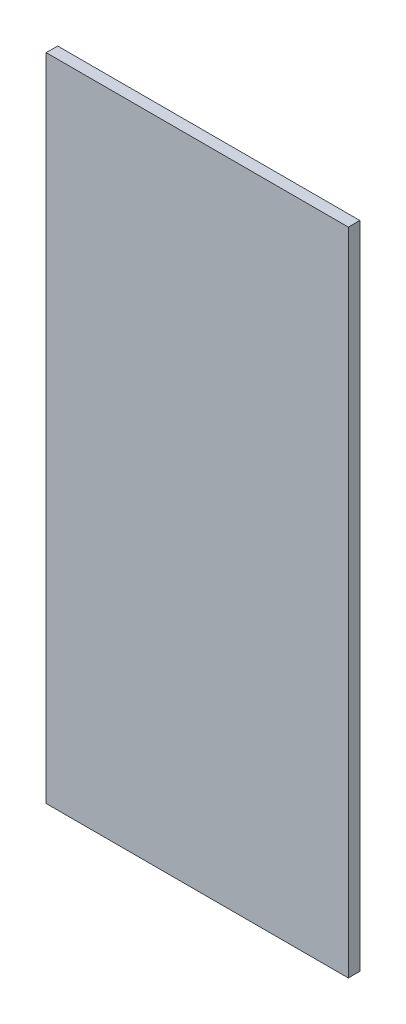
ISO-10303-21;
HEADER;
FILE_DESCRIPTION(('STEP AP214'),'2;1');
FILE_NAME('part.step','',(''),(''),'','','');
FILE_SCHEMA(('AUTOMOTIVE_DESIGN { 1 0 10303 214 1 1 1 1 }'));
ENDSEC;
DATA;
#1=APPLICATION_CONTEXT('core data for automotive mechanical design processes');
#2=APPLICATION_PROTOCOL_DEFINITION('international standard','automotive_design',2000,#1);
#3=PRODUCT_CONTEXT('',#1,'mechanical');
#4=PRODUCT('Part','Part','',(#3));
#5=PRODUCT_RELATED_PRODUCT_CATEGORY('part','',(#4));
#6=PRODUCT_DEFINITION_FORMATION('','',#4);
#7=PRODUCT_DEFINITION_CONTEXT('part definition',#1,'design');
#8=PRODUCT_DEFINITION('design','',#6,#7);
#9=PRODUCT_DEFINITION_SHAPE('','',#8);
#10=(LENGTH_UNIT() NAMED_UNIT(*) SI_UNIT(.MILLI.,.METRE.));
#11=(NAMED_UNIT(*) PLANE_ANGLE_UNIT() SI_UNIT($,.RADIAN.));
#12=(NAMED_UNIT(*) SI_UNIT($,.STERADIAN.) SOLID_ANGLE_UNIT());
#13=UNCERTAINTY_MEASURE_WITH_UNIT(LENGTH_MEASURE(1.E-05),#10,'distance_accuracy_value','');
#14=(GEOMETRIC_REPRESENTATION_CONTEXT(3) GLOBAL_UNCERTAINTY_ASSIGNED_CONTEXT((#13)) GLOBAL_UNIT_ASSIGNED_CONTEXT((#10,
#11,#12)) REPRESENTATION_CONTEXT('',''));
#15=CARTESIAN_POINT('',(0.,0.,0.));
#16=DIRECTION('',(0.,0.,1.));
#17=DIRECTION('',(1.,0.,0.));
#18=AXIS2_PLACEMENT_3D('',#15,#16,#17);
#19=CARTESIAN_POINT('',(13.15,-28.3,1.));
#20=DIRECTION('',(-1.,0.,0.));
#21=DIRECTION('',(0.,0.,1.));
#22=AXIS2_PLACEMENT_3D('',#19,#20,#21);
#23=PLANE('',#22);
#24=DIRECTION('',(0.,1.,0.));
#25=VECTOR('',#24,1.);
#26=CARTESIAN_POINT('',(13.15,-28.3,0.));
#27=LINE('',#26,#25);
#28=CARTESIAN_POINT('',(13.15,-28.3,0.));
#29=VERTEX_POINT('',#28);
#30=CARTESIAN_POINT('',(13.15,28.3,0.));
#31=VERTEX_POINT('',#30);
#32=EDGE_CURVE('E96',#29,#31,#27,.T.);
#33=ORIENTED_EDGE('',*,*,#32,.T.);
#34=DIRECTION('',(0.,0.,-1.));
#35=VECTOR('',#34,1.);
#36=CARTESIAN_POINT('',(13.15,28.3,1.));
#37=LINE('',#36,#35);
#38=CARTESIAN_POINT('',(13.15,28.3,1.));
#39=VERTEX_POINT('',#38);
#40=EDGE_CURVE('E11',#39,#31,#37,.T.);
#41=ORIENTED_EDGE('',*,*,#40,.F.);
#42=DIRECTION('',(0.,1.,0.));
#43=VECTOR('',#42,1.);
#44=CARTESIAN_POINT('',(13.15,-28.3,1.));
#45=LINE('',#44,#43);
#46=CARTESIAN_POINT('',(13.15,-28.3,1.));
#47=VERTEX_POINT('',#46);
#48=EDGE_CURVE('E84',#47,#39,#45,.T.);
#49=ORIENTED_EDGE('',*,*,#48,.F.);
#50=DIRECTION('',(0.,0.,-1.));
#51=VECTOR('',#50,1.);
#52=CARTESIAN_POINT('',(13.15,-28.3,1.));
#53=LINE('',#52,#51);
#54=EDGE_CURVE('E92',#47,#29,#53,.T.);
#55=ORIENTED_EDGE('',*,*,#54,.T.);
#56=EDGE_LOOP('',(#33,#41,#49,#55));
#57=FACE_BOUND('',#56,.T.);
#58=ADVANCED_FACE('F33',(#57),#23,.F.);
#59=CARTESIAN_POINT('',(-13.15,28.3,1.));
#60=DIRECTION('',(0.,-1.,0.));
#61=DIRECTION('',(0.,0.,-1.));
#62=AXIS2_PLACEMENT_3D('',#59,#60,#61);
#63=PLANE('',#62);
#64=DIRECTION('',(-1.,0.,0.));
#65=VECTOR('',#64,1.);
#66=CARTESIAN_POINT('',(-13.15,28.3,0.));
#67=LINE('',#66,#65);
#68=CARTESIAN_POINT('',(-13.15,28.3,0.));
#69=VERTEX_POINT('',#68);
#70=EDGE_CURVE('E88',#31,#69,#67,.T.);
#71=ORIENTED_EDGE('',*,*,#70,.T.);
#72=DIRECTION('',(0.,0.,-1.));
#73=VECTOR('',#72,1.);
#74=CARTESIAN_POINT('',(-13.15,28.3,1.));
#75=LINE('',#74,#73);
#76=CARTESIAN_POINT('',(-13.15,28.3,1.));
#77=VERTEX_POINT('',#76);
#78=EDGE_CURVE('E41',#77,#69,#75,.T.);
#79=ORIENTED_EDGE('',*,*,#78,.F.);
#80=DIRECTION('',(-1.,0.,0.));
#81=VECTOR('',#80,1.);
#82=CARTESIAN_POINT('',(-13.15,28.3,1.));
#83=LINE('',#82,#81);
#84=EDGE_CURVE('E79',#39,#77,#83,.T.);
#85=ORIENTED_EDGE('',*,*,#84,.F.);
#86=ORIENTED_EDGE('',*,*,#40,.T.);
#87=EDGE_LOOP('',(#71,#79,#85,#86));
#88=FACE_BOUND('',#87,.T.);
#89=ADVANCED_FACE('F87',(#88),#63,.F.);
#90=CARTESIAN_POINT('',(-13.15,-28.3,1.));
#91=DIRECTION('',(1.,0.,0.));
#92=DIRECTION('',(0.,0.,-1.));
#93=AXIS2_PLACEMENT_3D('',#90,#91,#92);
#94=PLANE('',#93);
#95=DIRECTION('',(0.,-1.,0.));
#96=VECTOR('',#95,1.);
#97=CARTESIAN_POINT('',(-13.15,-28.3,0.));
#98=LINE('',#97,#96);
#99=CARTESIAN_POINT('',(-13.15,-28.3,0.));
#100=VERTEX_POINT('',#99);
#101=EDGE_CURVE('E66',#69,#100,#98,.T.);
#102=ORIENTED_EDGE('',*,*,#101,.T.);
#103=DIRECTION('',(0.,0.,-1.));
#104=VECTOR('',#103,1.);
#105=CARTESIAN_POINT('',(-13.15,-28.3,1.));
#106=LINE('',#105,#104);
#107=CARTESIAN_POINT('',(-13.15,-28.3,1.));
#108=VERTEX_POINT('',#107);
#109=EDGE_CURVE('E89',#108,#100,#106,.T.);
#110=ORIENTED_EDGE('',*,*,#109,.F.);
#111=DIRECTION('',(0.,-1.,0.));
#112=VECTOR('',#111,1.);
#113=CARTESIAN_POINT('',(-13.15,-28.3,1.));
#114=LINE('',#113,#112);
#115=EDGE_CURVE('E82',#77,#108,#114,.T.);
#116=ORIENTED_EDGE('',*,*,#115,.F.);
#117=ORIENTED_EDGE('',*,*,#78,.T.);
#118=EDGE_LOOP('',(#102,#110,#116,#117));
#119=FACE_BOUND('',#118,.T.);
#120=ADVANCED_FACE('F90',(#119),#94,.F.);
#121=CARTESIAN_POINT('',(-13.15,-28.3,1.));
#122=DIRECTION('',(0.,1.,0.));
#123=DIRECTION('',(0.,0.,1.));
#124=AXIS2_PLACEMENT_3D('',#121,#122,#123);
#125=PLANE('',#124);
#126=DIRECTION('',(1.,0.,0.));
#127=VECTOR('',#126,1.);
#128=CARTESIAN_POINT('',(-13.15,-28.3,0.));
#129=LINE('',#128,#127);
#130=EDGE_CURVE('E72',#100,#29,#129,.T.);
#131=ORIENTED_EDGE('',*,*,#130,.T.);
#132=ORIENTED_EDGE('',*,*,#54,.F.);
#133=DIRECTION('',(1.,0.,0.));
#134=VECTOR('',#133,1.);
#135=CARTESIAN_POINT('',(-13.15,-28.3,1.));
#136=LINE('',#135,#134);
#137=EDGE_CURVE('E49',#108,#47,#136,.T.);
#138=ORIENTED_EDGE('',*,*,#137,.F.);
#139=ORIENTED_EDGE('',*,*,#109,.T.);
#140=EDGE_LOOP('',(#131,#132,#138,#139));
#141=FACE_BOUND('',#140,.T.);
#142=ADVANCED_FACE('F103',(#141),#125,.F.);
#143=CARTESIAN_POINT('',(0.,0.,1.));
#144=DIRECTION('',(0.,0.,-1.));
#145=DIRECTION('',(-1.,0.,0.));
#146=AXIS2_PLACEMENT_3D('',#143,#144,#145);
#147=PLANE('',#146);
#148=ORIENTED_EDGE('',*,*,#48,.T.);
#149=ORIENTED_EDGE('',*,*,#84,.T.);
#150=ORIENTED_EDGE('',*,*,#115,.T.);
#151=ORIENTED_EDGE('',*,*,#137,.T.);
#152=EDGE_LOOP('',(#148,#149,#150,#151));
#153=FACE_BOUND('',#152,.T.);
#154=ADVANCED_FACE('F80',(#153),#147,.F.);
#155=CARTESIAN_POINT('',(0.,0.,0.));
#156=DIRECTION('',(0.,0.,-1.));
#157=DIRECTION('',(-1.,0.,0.));
#158=AXIS2_PLACEMENT_3D('',#155,#156,#157);
#159=PLANE('',#158);
#160=ORIENTED_EDGE('',*,*,#32,.F.);
#161=ORIENTED_EDGE('',*,*,#130,.F.);
#162=ORIENTED_EDGE('',*,*,#101,.F.);
#163=ORIENTED_EDGE('',*,*,#70,.F.);
#164=EDGE_LOOP('',(#160,#161,#162,#163));
#165=FACE_BOUND('',#164,.T.);
#166=ADVANCED_FACE('F106',(#165),#159,.T.);
#167=CLOSED_SHELL('',(#58,#89,#120,#142,#154,#166));
#168=MANIFOLD_SOLID_BREP('B2',#167);
#169=ADVANCED_BREP_SHAPE_REPRESENTATION('',(#18,#168),#14);
#170=SHAPE_DEFINITION_REPRESENTATION(#9,#169);
ENDSEC;
END-ISO-10303-21;
